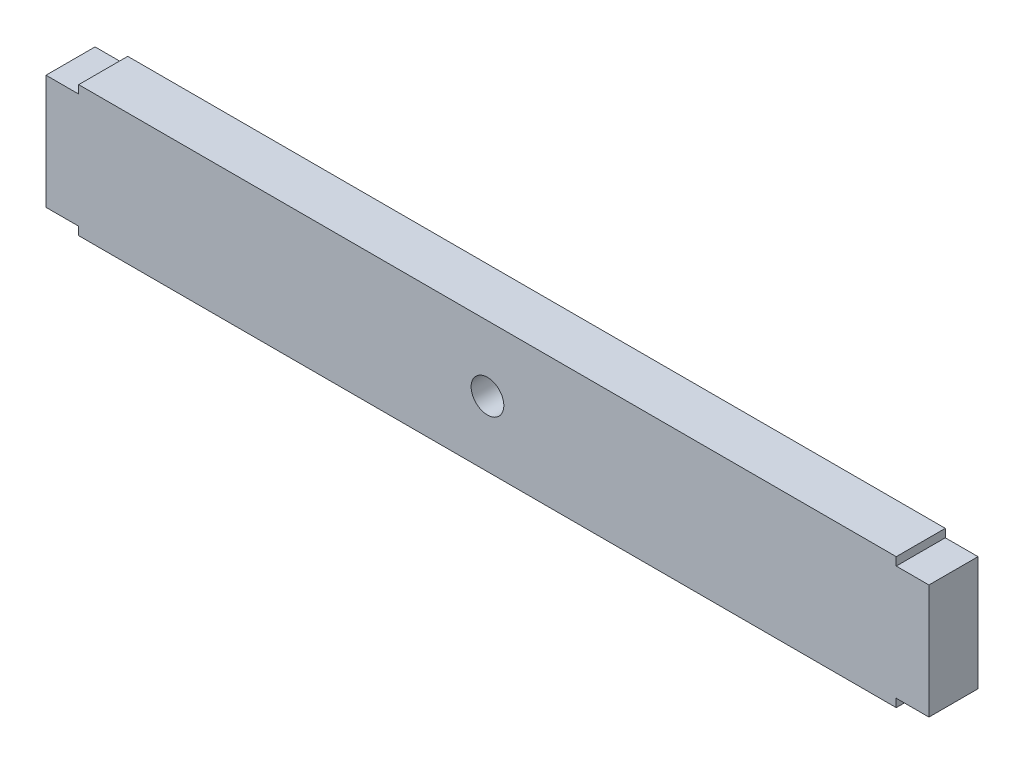
ISO-10303-21;
HEADER;
FILE_DESCRIPTION(('STEP AP214'),'2;1');
FILE_NAME('part.step','',(''),(''),'','','');
FILE_SCHEMA(('AUTOMOTIVE_DESIGN { 1 0 10303 214 1 1 1 1 }'));
ENDSEC;
DATA;
#1=APPLICATION_CONTEXT('core data for automotive mechanical design processes');
#2=APPLICATION_PROTOCOL_DEFINITION('international standard','automotive_design',2000,#1);
#3=PRODUCT_CONTEXT('',#1,'mechanical');
#4=PRODUCT('Part','Part','',(#3));
#5=PRODUCT_RELATED_PRODUCT_CATEGORY('part','',(#4));
#6=PRODUCT_DEFINITION_FORMATION('','',#4);
#7=PRODUCT_DEFINITION_CONTEXT('part definition',#1,'design');
#8=PRODUCT_DEFINITION('design','',#6,#7);
#9=PRODUCT_DEFINITION_SHAPE('','',#8);
#10=(LENGTH_UNIT() NAMED_UNIT(*) SI_UNIT(.MILLI.,.METRE.));
#11=(NAMED_UNIT(*) PLANE_ANGLE_UNIT() SI_UNIT($,.RADIAN.));
#12=(NAMED_UNIT(*) SI_UNIT($,.STERADIAN.) SOLID_ANGLE_UNIT());
#13=UNCERTAINTY_MEASURE_WITH_UNIT(LENGTH_MEASURE(1.E-05),#10,'distance_accuracy_value','');
#14=(GEOMETRIC_REPRESENTATION_CONTEXT(3) GLOBAL_UNCERTAINTY_ASSIGNED_CONTEXT((#13)) GLOBAL_UNIT_ASSIGNED_CONTEXT((#10,
#11,#12)) REPRESENTATION_CONTEXT('',''));
#15=CARTESIAN_POINT('',(0.,0.,0.));
#16=DIRECTION('',(0.,0.,1.));
#17=DIRECTION('',(1.,0.,0.));
#18=AXIS2_PLACEMENT_3D('',#15,#16,#17);
#19=CARTESIAN_POINT('',(0.,-35.,30.));
#20=DIRECTION('',(0.,-1.,0.));
#21=DIRECTION('',(0.,0.,-1.));
#22=AXIS2_PLACEMENT_3D('',#19,#20,#21);
#23=PLANE('',#22);
#24=DIRECTION('',(-1.,0.,0.));
#25=VECTOR('',#24,1.);
#26=CARTESIAN_POINT('',(0.,-35.,0.));
#27=LINE('',#26,#25);
#28=CARTESIAN_POINT('',(-250.,-35.,0.));
#29=VERTEX_POINT('',#28);
#30=CARTESIAN_POINT('',(-270.,-35.,0.));
#31=VERTEX_POINT('',#30);
#32=EDGE_CURVE('E181',#29,#31,#27,.T.);
#33=ORIENTED_EDGE('',*,*,#32,.F.);
#34=DIRECTION('',(0.,0.,-1.));
#35=VECTOR('',#34,1.);
#36=CARTESIAN_POINT('',(-250.,-35.,30.));
#37=LINE('',#36,#35);
#38=CARTESIAN_POINT('',(-250.,-35.,30.));
#39=VERTEX_POINT('',#38);
#40=EDGE_CURVE('E185',#39,#29,#37,.T.);
#41=ORIENTED_EDGE('',*,*,#40,.F.);
#42=DIRECTION('',(-1.,0.,0.));
#43=VECTOR('',#42,1.);
#44=CARTESIAN_POINT('',(0.,-35.,30.));
#45=LINE('',#44,#43);
#46=CARTESIAN_POINT('',(-270.,-35.,30.));
#47=VERTEX_POINT('',#46);
#48=EDGE_CURVE('E189',#39,#47,#45,.T.);
#49=ORIENTED_EDGE('',*,*,#48,.T.);
#50=DIRECTION('',(0.,0.,-1.));
#51=VECTOR('',#50,1.);
#52=CARTESIAN_POINT('',(-270.,-35.,30.));
#53=LINE('',#52,#51);
#54=EDGE_CURVE('E188',#47,#31,#53,.T.);
#55=ORIENTED_EDGE('',*,*,#54,.T.);
#56=EDGE_LOOP('',(#33,#41,#49,#55));
#57=FACE_BOUND('',#56,.T.);
#58=ADVANCED_FACE('F70',(#57),#23,.T.);
#59=CARTESIAN_POINT('',(-270.,-424.747120799851,30.));
#60=DIRECTION('',(-1.,0.,0.));
#61=DIRECTION('',(0.,0.,1.));
#62=AXIS2_PLACEMENT_3D('',#59,#60,#61);
#63=PLANE('',#62);
#64=DIRECTION('',(0.,1.,0.));
#65=VECTOR('',#64,1.);
#66=CARTESIAN_POINT('',(-270.,-424.747120799851,0.));
#67=LINE('',#66,#65);
#68=CARTESIAN_POINT('',(-270.,35.,0.));
#69=VERTEX_POINT('',#68);
#70=EDGE_CURVE('E178',#31,#69,#67,.T.);
#71=ORIENTED_EDGE('',*,*,#70,.F.);
#72=ORIENTED_EDGE('',*,*,#54,.F.);
#73=DIRECTION('',(0.,1.,0.));
#74=VECTOR('',#73,1.);
#75=CARTESIAN_POINT('',(-270.,-424.747120799851,30.));
#76=LINE('',#75,#74);
#77=CARTESIAN_POINT('',(-270.,35.,30.));
#78=VERTEX_POINT('',#77);
#79=EDGE_CURVE('E242',#47,#78,#76,.T.);
#80=ORIENTED_EDGE('',*,*,#79,.T.);
#81=DIRECTION('',(0.,0.,-1.));
#82=VECTOR('',#81,1.);
#83=CARTESIAN_POINT('',(-270.,35.,30.));
#84=LINE('',#83,#82);
#85=EDGE_CURVE('E192',#78,#69,#84,.T.);
#86=ORIENTED_EDGE('',*,*,#85,.T.);
#87=EDGE_LOOP('',(#71,#72,#80,#86));
#88=FACE_BOUND('',#87,.T.);
#89=ADVANCED_FACE('F319',(#88),#63,.T.);
#90=CARTESIAN_POINT('',(-1.15078942796833E-13,35.0000000000001,30.));
#91=DIRECTION('',(0.,-1.,0.));
#92=DIRECTION('',(1.,0.,0.));
#93=AXIS2_PLACEMENT_3D('',#90,#91,#92);
#94=PLANE('',#93);
#95=DIRECTION('',(-1.,0.,0.));
#96=VECTOR('',#95,1.);
#97=CARTESIAN_POINT('',(-1.15078942796833E-13,35.0000000000001,0.));
#98=LINE('',#97,#96);
#99=CARTESIAN_POINT('',(-250.,35.,0.));
#100=VERTEX_POINT('',#99);
#101=EDGE_CURVE('E175',#100,#69,#98,.T.);
#102=ORIENTED_EDGE('',*,*,#101,.T.);
#103=ORIENTED_EDGE('',*,*,#85,.F.);
#104=DIRECTION('',(-1.,0.,0.));
#105=VECTOR('',#104,1.);
#106=CARTESIAN_POINT('',(-1.15078942796833E-13,35.0000000000001,30.));
#107=LINE('',#106,#105);
#108=CARTESIAN_POINT('',(-250.,35.,30.));
#109=VERTEX_POINT('',#108);
#110=EDGE_CURVE('E239',#109,#78,#107,.T.);
#111=ORIENTED_EDGE('',*,*,#110,.F.);
#112=DIRECTION('',(0.,0.,-1.));
#113=VECTOR('',#112,1.);
#114=CARTESIAN_POINT('',(-250.,35.,30.));
#115=LINE('',#114,#113);
#116=EDGE_CURVE('E195',#109,#100,#115,.T.);
#117=ORIENTED_EDGE('',*,*,#116,.T.);
#118=EDGE_LOOP('',(#102,#103,#111,#117));
#119=FACE_BOUND('',#118,.T.);
#120=ADVANCED_FACE('F325',(#119),#94,.F.);
#121=CARTESIAN_POINT('',(-250.,-424.747120799851,30.));
#122=DIRECTION('',(-1.,0.,0.));
#123=DIRECTION('',(0.,0.,1.));
#124=AXIS2_PLACEMENT_3D('',#121,#122,#123);
#125=PLANE('',#124);
#126=DIRECTION('',(0.,1.,0.));
#127=VECTOR('',#126,1.);
#128=CARTESIAN_POINT('',(-250.,-424.747120799851,0.));
#129=LINE('',#128,#127);
#130=CARTESIAN_POINT('',(-250.,40.,0.));
#131=VERTEX_POINT('',#130);
#132=EDGE_CURVE('E161',#100,#131,#129,.T.);
#133=ORIENTED_EDGE('',*,*,#132,.F.);
#134=ORIENTED_EDGE('',*,*,#116,.F.);
#135=DIRECTION('',(0.,1.,0.));
#136=VECTOR('',#135,1.);
#137=CARTESIAN_POINT('',(-250.,-424.747120799851,30.));
#138=LINE('',#137,#136);
#139=CARTESIAN_POINT('',(-250.,40.,30.));
#140=VERTEX_POINT('',#139);
#141=EDGE_CURVE('E232',#109,#140,#138,.T.);
#142=ORIENTED_EDGE('',*,*,#141,.T.);
#143=DIRECTION('',(0.,0.,-1.));
#144=VECTOR('',#143,1.);
#145=CARTESIAN_POINT('',(-250.,40.,30.));
#146=LINE('',#145,#144);
#147=EDGE_CURVE('E198',#140,#131,#146,.T.);
#148=ORIENTED_EDGE('',*,*,#147,.T.);
#149=EDGE_LOOP('',(#133,#134,#142,#148));
#150=FACE_BOUND('',#149,.T.);
#151=ADVANCED_FACE('F260',(#150),#125,.T.);
#152=CARTESIAN_POINT('',(-250.,-40.0000000000001,0.));
#153=VERTEX_POINT('',#152);
#154=EDGE_CURVE('E248',#153,#29,#129,.T.);
#155=ORIENTED_EDGE('',*,*,#154,.F.);
#156=DIRECTION('',(0.,0.,-1.));
#157=VECTOR('',#156,1.);
#158=CARTESIAN_POINT('',(-250.,-40.0000000000001,30.));
#159=LINE('',#158,#157);
#160=CARTESIAN_POINT('',(-250.,-40.0000000000001,30.));
#161=VERTEX_POINT('',#160);
#162=EDGE_CURVE('E167',#161,#153,#159,.T.);
#163=ORIENTED_EDGE('',*,*,#162,.F.);
#164=EDGE_CURVE('E300',#161,#39,#138,.T.);
#165=ORIENTED_EDGE('',*,*,#164,.T.);
#166=ORIENTED_EDGE('',*,*,#40,.T.);
#167=EDGE_LOOP('',(#155,#163,#165,#166));
#168=FACE_BOUND('',#167,.T.);
#169=ADVANCED_FACE('F333',(#168),#125,.T.);
#170=CARTESIAN_POINT('',(0.,0.,30.));
#171=DIRECTION('',(0.,0.,-1.));
#172=DIRECTION('',(-1.,0.,0.));
#173=AXIS2_PLACEMENT_3D('',#170,#171,#172);
#174=CYLINDRICAL_SURFACE('',#173,10.);
#175=CARTESIAN_POINT('',(0.,0.,30.));
#176=DIRECTION('',(0.,0.,1.));
#177=DIRECTION('',(1.,0.,0.));
#178=AXIS2_PLACEMENT_3D('',#175,#176,#177);
#179=CIRCLE('',#178,10.);
#180=CARTESIAN_POINT('',(10.0000000000001,0.,30.));
#181=VERTEX_POINT('',#180);
#182=EDGE_CURVE('E184',#181,#181,#179,.T.);
#183=ORIENTED_EDGE('',*,*,#182,.T.);
#184=EDGE_LOOP('',(#183));
#185=FACE_BOUND('',#184,.T.);
#186=CARTESIAN_POINT('',(0.,0.,0.));
#187=DIRECTION('',(0.,0.,1.));
#188=DIRECTION('',(1.,0.,0.));
#189=AXIS2_PLACEMENT_3D('',#186,#187,#188);
#190=CIRCLE('',#189,10.);
#191=CARTESIAN_POINT('',(10.0000000000001,0.,0.));
#192=VERTEX_POINT('',#191);
#193=EDGE_CURVE('E220',#192,#192,#190,.T.);
#194=ORIENTED_EDGE('',*,*,#193,.F.);
#195=EDGE_LOOP('',(#194));
#196=FACE_BOUND('',#195,.T.);
#197=ADVANCED_FACE('F306',(#185,#196),#174,.F.);
#198=CARTESIAN_POINT('',(0.,-40.,30.));
#199=DIRECTION('',(0.,-1.,0.));
#200=DIRECTION('',(1.,0.,0.));
#201=AXIS2_PLACEMENT_3D('',#198,#199,#200);
#202=PLANE('',#201);
#203=DIRECTION('',(-1.,0.,0.));
#204=VECTOR('',#203,1.);
#205=CARTESIAN_POINT('',(0.,-40.,0.));
#206=LINE('',#205,#204);
#207=CARTESIAN_POINT('',(250.,-40.,0.));
#208=VERTEX_POINT('',#207);
#209=EDGE_CURVE('E163',#208,#153,#206,.T.);
#210=ORIENTED_EDGE('',*,*,#209,.F.);
#211=DIRECTION('',(0.,0.,-1.));
#212=VECTOR('',#211,1.);
#213=CARTESIAN_POINT('',(250.,-40.,30.));
#214=LINE('',#213,#212);
#215=CARTESIAN_POINT('',(250.,-40.,30.));
#216=VERTEX_POINT('',#215);
#217=EDGE_CURVE('E157',#216,#208,#214,.T.);
#218=ORIENTED_EDGE('',*,*,#217,.F.);
#219=DIRECTION('',(-1.,0.,0.));
#220=VECTOR('',#219,1.);
#221=CARTESIAN_POINT('',(0.,-40.,30.));
#222=LINE('',#221,#220);
#223=EDGE_CURVE('E229',#216,#161,#222,.T.);
#224=ORIENTED_EDGE('',*,*,#223,.T.);
#225=ORIENTED_EDGE('',*,*,#162,.T.);
#226=EDGE_LOOP('',(#210,#218,#224,#225));
#227=FACE_BOUND('',#226,.T.);
#228=ADVANCED_FACE('F335',(#227),#202,.T.);
#229=CARTESIAN_POINT('',(0.,40.,30.));
#230=DIRECTION('',(0.,-1.,0.));
#231=DIRECTION('',(1.,0.,0.));
#232=AXIS2_PLACEMENT_3D('',#229,#230,#231);
#233=PLANE('',#232);
#234=DIRECTION('',(-1.,0.,0.));
#235=VECTOR('',#234,1.);
#236=CARTESIAN_POINT('',(0.,40.,0.));
#237=LINE('',#236,#235);
#238=CARTESIAN_POINT('',(250.,40.,0.));
#239=VERTEX_POINT('',#238);
#240=EDGE_CURVE('E158',#239,#131,#237,.T.);
#241=ORIENTED_EDGE('',*,*,#240,.T.);
#242=ORIENTED_EDGE('',*,*,#147,.F.);
#243=DIRECTION('',(-1.,0.,0.));
#244=VECTOR('',#243,1.);
#245=CARTESIAN_POINT('',(0.,40.,30.));
#246=LINE('',#245,#244);
#247=CARTESIAN_POINT('',(250.,40.,30.));
#248=VERTEX_POINT('',#247);
#249=EDGE_CURVE('E230',#248,#140,#246,.T.);
#250=ORIENTED_EDGE('',*,*,#249,.F.);
#251=DIRECTION('',(0.,0.,-1.));
#252=VECTOR('',#251,1.);
#253=CARTESIAN_POINT('',(250.,40.,30.));
#254=LINE('',#253,#252);
#255=EDGE_CURVE('E201',#248,#239,#254,.T.);
#256=ORIENTED_EDGE('',*,*,#255,.T.);
#257=EDGE_LOOP('',(#241,#242,#250,#256));
#258=FACE_BOUND('',#257,.T.);
#259=ADVANCED_FACE('F296',(#258),#233,.F.);
#260=CARTESIAN_POINT('',(0.,-424.747120799851,0.));
#261=DIRECTION('',(0.,0.,1.));
#262=DIRECTION('',(1.,0.,0.));
#263=AXIS2_PLACEMENT_3D('',#260,#261,#262);
#264=PLANE('',#263);
#265=ORIENTED_EDGE('',*,*,#193,.T.);
#266=EDGE_LOOP('',(#265));
#267=FACE_BOUND('',#266,.T.);
#268=ORIENTED_EDGE('',*,*,#154,.T.);
#269=ORIENTED_EDGE('',*,*,#32,.T.);
#270=ORIENTED_EDGE('',*,*,#70,.T.);
#271=ORIENTED_EDGE('',*,*,#101,.F.);
#272=ORIENTED_EDGE('',*,*,#132,.T.);
#273=ORIENTED_EDGE('',*,*,#240,.F.);
#274=DIRECTION('',(0.,1.,0.));
#275=VECTOR('',#274,1.);
#276=CARTESIAN_POINT('',(250.,-424.747120799851,0.));
#277=LINE('',#276,#275);
#278=CARTESIAN_POINT('',(250.,35.,0.));
#279=VERTEX_POINT('',#278);
#280=EDGE_CURVE('E128',#279,#239,#277,.T.);
#281=ORIENTED_EDGE('',*,*,#280,.F.);
#282=DIRECTION('',(1.,0.,0.));
#283=VECTOR('',#282,1.);
#284=CARTESIAN_POINT('',(250.,35.,0.));
#285=LINE('',#284,#283);
#286=CARTESIAN_POINT('',(270.,35.,0.));
#287=VERTEX_POINT('',#286);
#288=EDGE_CURVE('E113',#279,#287,#285,.T.);
#289=ORIENTED_EDGE('',*,*,#288,.T.);
#290=DIRECTION('',(0.,1.,0.));
#291=VECTOR('',#290,1.);
#292=CARTESIAN_POINT('',(270.,-35.,0.));
#293=LINE('',#292,#291);
#294=CARTESIAN_POINT('',(270.,-35.,0.));
#295=VERTEX_POINT('',#294);
#296=EDGE_CURVE('E107',#295,#287,#293,.T.);
#297=ORIENTED_EDGE('',*,*,#296,.F.);
#298=DIRECTION('',(1.,0.,0.));
#299=VECTOR('',#298,1.);
#300=CARTESIAN_POINT('',(250.,-35.,0.));
#301=LINE('',#300,#299);
#302=CARTESIAN_POINT('',(250.,-35.,0.));
#303=VERTEX_POINT('',#302);
#304=EDGE_CURVE('E122',#303,#295,#301,.T.);
#305=ORIENTED_EDGE('',*,*,#304,.F.);
#306=EDGE_CURVE('E148',#208,#303,#277,.T.);
#307=ORIENTED_EDGE('',*,*,#306,.F.);
#308=ORIENTED_EDGE('',*,*,#209,.T.);
#309=EDGE_LOOP('',(#268,#269,#270,#271,#272,#273,#281,#289,#297,#305,#307,#308));
#310=FACE_BOUND('',#309,.T.);
#311=ADVANCED_FACE('F125',(#267,#310),#264,.F.);
#312=CARTESIAN_POINT('',(0.,-424.747120799851,30.));
#313=DIRECTION('',(0.,0.,1.));
#314=DIRECTION('',(1.,0.,0.));
#315=AXIS2_PLACEMENT_3D('',#312,#313,#314);
#316=PLANE('',#315);
#317=ORIENTED_EDGE('',*,*,#182,.F.);
#318=EDGE_LOOP('',(#317));
#319=FACE_BOUND('',#318,.T.);
#320=ORIENTED_EDGE('',*,*,#164,.F.);
#321=ORIENTED_EDGE('',*,*,#223,.F.);
#322=DIRECTION('',(0.,1.,0.));
#323=VECTOR('',#322,1.);
#324=CARTESIAN_POINT('',(250.,-424.747120799851,30.));
#325=LINE('',#324,#323);
#326=CARTESIAN_POINT('',(250.,-35.,30.));
#327=VERTEX_POINT('',#326);
#328=EDGE_CURVE('E227',#216,#327,#325,.T.);
#329=ORIENTED_EDGE('',*,*,#328,.T.);
#330=DIRECTION('',(1.,0.,0.));
#331=VECTOR('',#330,1.);
#332=CARTESIAN_POINT('',(250.,-35.,30.));
#333=LINE('',#332,#331);
#334=CARTESIAN_POINT('',(270.,-35.,30.));
#335=VERTEX_POINT('',#334);
#336=EDGE_CURVE('E129',#327,#335,#333,.T.);
#337=ORIENTED_EDGE('',*,*,#336,.T.);
#338=DIRECTION('',(0.,1.,0.));
#339=VECTOR('',#338,1.);
#340=CARTESIAN_POINT('',(270.,-35.,30.));
#341=LINE('',#340,#339);
#342=CARTESIAN_POINT('',(270.,35.,30.));
#343=VERTEX_POINT('',#342);
#344=EDGE_CURVE('E132',#335,#343,#341,.T.);
#345=ORIENTED_EDGE('',*,*,#344,.T.);
#346=DIRECTION('',(1.,0.,0.));
#347=VECTOR('',#346,1.);
#348=CARTESIAN_POINT('',(250.,35.,30.));
#349=LINE('',#348,#347);
#350=CARTESIAN_POINT('',(250.,35.,30.));
#351=VERTEX_POINT('',#350);
#352=EDGE_CURVE('E115',#351,#343,#349,.T.);
#353=ORIENTED_EDGE('',*,*,#352,.F.);
#354=EDGE_CURVE('E213',#351,#248,#325,.T.);
#355=ORIENTED_EDGE('',*,*,#354,.T.);
#356=ORIENTED_EDGE('',*,*,#249,.T.);
#357=ORIENTED_EDGE('',*,*,#141,.F.);
#358=ORIENTED_EDGE('',*,*,#110,.T.);
#359=ORIENTED_EDGE('',*,*,#79,.F.);
#360=ORIENTED_EDGE('',*,*,#48,.F.);
#361=EDGE_LOOP('',(#320,#321,#329,#337,#345,#353,#355,#356,#357,#358,#359,#360));
#362=FACE_BOUND('',#361,.T.);
#363=ADVANCED_FACE('F223',(#319,#362),#316,.T.);
#364=CARTESIAN_POINT('',(250.,-424.747120799851,30.));
#365=DIRECTION('',(-1.,0.,0.));
#366=DIRECTION('',(0.,0.,1.));
#367=AXIS2_PLACEMENT_3D('',#364,#365,#366);
#368=PLANE('',#367);
#369=ORIENTED_EDGE('',*,*,#354,.F.);
#370=DIRECTION('',(0.,0.,-1.));
#371=VECTOR('',#370,1.);
#372=CARTESIAN_POINT('',(250.,35.,30.));
#373=LINE('',#372,#371);
#374=EDGE_CURVE('E80',#351,#279,#373,.T.);
#375=ORIENTED_EDGE('',*,*,#374,.T.);
#376=ORIENTED_EDGE('',*,*,#280,.T.);
#377=ORIENTED_EDGE('',*,*,#255,.F.);
#378=EDGE_LOOP('',(#369,#375,#376,#377));
#379=FACE_BOUND('',#378,.T.);
#380=ADVANCED_FACE('F293',(#379),#368,.F.);
#381=DIRECTION('',(0.,0.,-1.));
#382=VECTOR('',#381,1.);
#383=CARTESIAN_POINT('',(250.,-35.,30.));
#384=LINE('',#383,#382);
#385=EDGE_CURVE('E12',#327,#303,#384,.T.);
#386=ORIENTED_EDGE('',*,*,#385,.F.);
#387=ORIENTED_EDGE('',*,*,#328,.F.);
#388=ORIENTED_EDGE('',*,*,#217,.T.);
#389=ORIENTED_EDGE('',*,*,#306,.T.);
#390=EDGE_LOOP('',(#386,#387,#388,#389));
#391=FACE_BOUND('',#390,.T.);
#392=ADVANCED_FACE('F154',(#391),#368,.F.);
#393=CARTESIAN_POINT('',(270.,-35.,30.));
#394=DIRECTION('',(-1.,0.,0.));
#395=DIRECTION('',(0.,0.,1.));
#396=AXIS2_PLACEMENT_3D('',#393,#394,#395);
#397=PLANE('',#396);
#398=ORIENTED_EDGE('',*,*,#296,.T.);
#399=DIRECTION('',(0.,0.,-1.));
#400=VECTOR('',#399,1.);
#401=CARTESIAN_POINT('',(270.,35.,30.));
#402=LINE('',#401,#400);
#403=EDGE_CURVE('E111',#343,#287,#402,.T.);
#404=ORIENTED_EDGE('',*,*,#403,.F.);
#405=ORIENTED_EDGE('',*,*,#344,.F.);
#406=DIRECTION('',(0.,0.,-1.));
#407=VECTOR('',#406,1.);
#408=CARTESIAN_POINT('',(270.,-35.,30.));
#409=LINE('',#408,#407);
#410=EDGE_CURVE('E117',#335,#295,#409,.T.);
#411=ORIENTED_EDGE('',*,*,#410,.T.);
#412=EDGE_LOOP('',(#398,#404,#405,#411));
#413=FACE_BOUND('',#412,.T.);
#414=ADVANCED_FACE('F119',(#413),#397,.F.);
#415=CARTESIAN_POINT('',(250.,35.,30.));
#416=DIRECTION('',(0.,1.,0.));
#417=DIRECTION('',(0.,0.,1.));
#418=AXIS2_PLACEMENT_3D('',#415,#416,#417);
#419=PLANE('',#418);
#420=ORIENTED_EDGE('',*,*,#288,.F.);
#421=ORIENTED_EDGE('',*,*,#374,.F.);
#422=ORIENTED_EDGE('',*,*,#352,.T.);
#423=ORIENTED_EDGE('',*,*,#403,.T.);
#424=EDGE_LOOP('',(#420,#421,#422,#423));
#425=FACE_BOUND('',#424,.T.);
#426=ADVANCED_FACE('F112',(#425),#419,.T.);
#427=CARTESIAN_POINT('',(250.,-35.,30.));
#428=DIRECTION('',(0.,1.,0.));
#429=DIRECTION('',(-1.,0.,0.));
#430=AXIS2_PLACEMENT_3D('',#427,#428,#429);
#431=PLANE('',#430);
#432=ORIENTED_EDGE('',*,*,#304,.T.);
#433=ORIENTED_EDGE('',*,*,#410,.F.);
#434=ORIENTED_EDGE('',*,*,#336,.F.);
#435=ORIENTED_EDGE('',*,*,#385,.T.);
#436=EDGE_LOOP('',(#432,#433,#434,#435));
#437=FACE_BOUND('',#436,.T.);
#438=ADVANCED_FACE('F72',(#437),#431,.F.);
#439=CLOSED_SHELL('',(#58,#89,#120,#151,#169,#197,#228,#259,#311,#363,#380,#392,#414,#426,#438));
#440=MANIFOLD_SOLID_BREP('B2',#439);
#441=ADVANCED_BREP_SHAPE_REPRESENTATION('',(#18,#440),#14);
#442=SHAPE_DEFINITION_REPRESENTATION(#9,#441);
ENDSEC;
END-ISO-10303-21;
